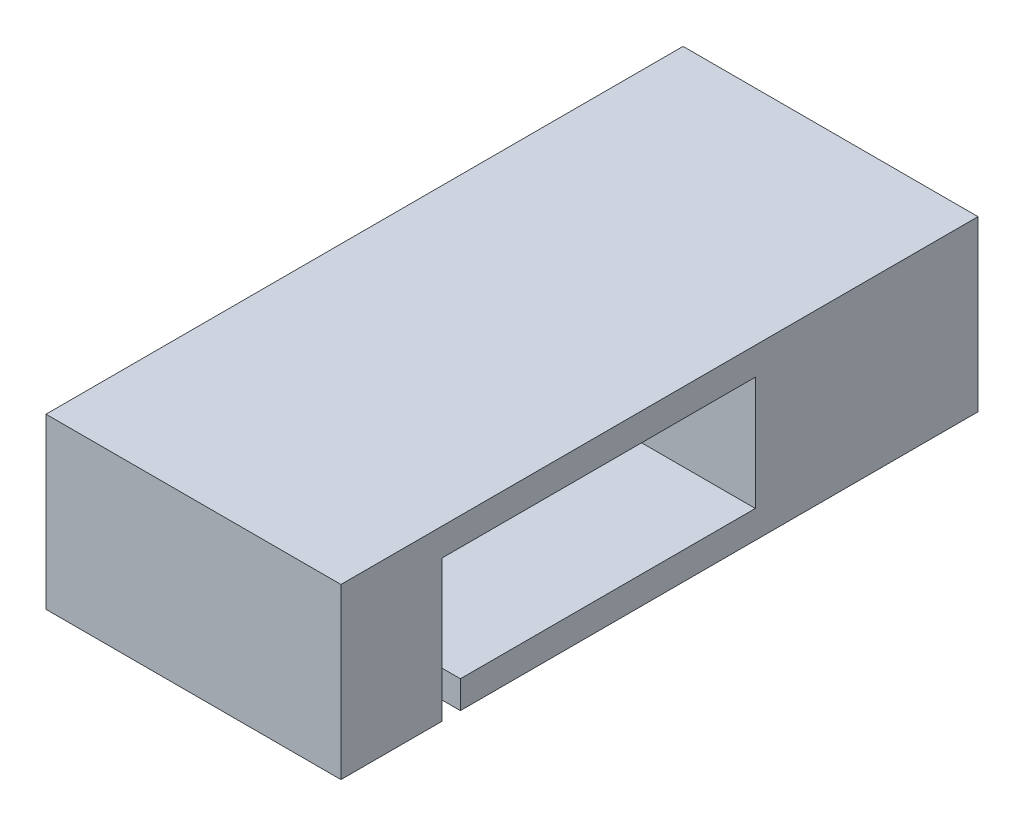
ISO-10303-21;
HEADER;
FILE_DESCRIPTION(('STEP AP214'),'2;1');
FILE_NAME('part.step','',(''),(''),'','','');
FILE_SCHEMA(('AUTOMOTIVE_DESIGN { 1 0 10303 214 1 1 1 1 }'));
ENDSEC;
DATA;
#1=APPLICATION_CONTEXT('core data for automotive mechanical design processes');
#2=APPLICATION_PROTOCOL_DEFINITION('international standard','automotive_design',2000,#1);
#3=PRODUCT_CONTEXT('',#1,'mechanical');
#4=PRODUCT('Part','Part','',(#3));
#5=PRODUCT_RELATED_PRODUCT_CATEGORY('part','',(#4));
#6=PRODUCT_DEFINITION_FORMATION('','',#4);
#7=PRODUCT_DEFINITION_CONTEXT('part definition',#1,'design');
#8=PRODUCT_DEFINITION('design','',#6,#7);
#9=PRODUCT_DEFINITION_SHAPE('','',#8);
#10=(LENGTH_UNIT() NAMED_UNIT(*) SI_UNIT(.MILLI.,.METRE.));
#11=(NAMED_UNIT(*) PLANE_ANGLE_UNIT() SI_UNIT($,.RADIAN.));
#12=(NAMED_UNIT(*) SI_UNIT($,.STERADIAN.) SOLID_ANGLE_UNIT());
#13=UNCERTAINTY_MEASURE_WITH_UNIT(LENGTH_MEASURE(1.E-05),#10,'distance_accuracy_value','');
#14=(GEOMETRIC_REPRESENTATION_CONTEXT(3) GLOBAL_UNCERTAINTY_ASSIGNED_CONTEXT((#13)) GLOBAL_UNIT_ASSIGNED_CONTEXT((#10,
#11,#12)) REPRESENTATION_CONTEXT('',''));
#15=CARTESIAN_POINT('',(0.,0.,0.));
#16=DIRECTION('',(0.,0.,1.));
#17=DIRECTION('',(1.,0.,0.));
#18=AXIS2_PLACEMENT_3D('',#15,#16,#17);
#19=CARTESIAN_POINT('',(16.,18.34,34.56));
#20=DIRECTION('',(-1.,0.,0.));
#21=DIRECTION('',(0.,0.,1.));
#22=AXIS2_PLACEMENT_3D('',#19,#20,#21);
#23=PLANE('',#22);
#24=DIRECTION('',(0.,0.,-1.));
#25=VECTOR('',#24,1.);
#26=CARTESIAN_POINT('',(16.,3.,21.6));
#27=LINE('',#26,#25);
#28=CARTESIAN_POINT('',(16.,3.,21.6));
#29=VERTEX_POINT('',#28);
#30=CARTESIAN_POINT('',(16.,3.,-10.4));
#31=VERTEX_POINT('',#30);
#32=EDGE_CURVE('E136',#29,#31,#27,.T.);
#33=ORIENTED_EDGE('',*,*,#32,.F.);
#34=DIRECTION('',(0.,1.,0.));
#35=VECTOR('',#34,1.);
#36=CARTESIAN_POINT('',(16.,0.,21.6));
#37=LINE('',#36,#35);
#38=CARTESIAN_POINT('',(16.,0.,21.6));
#39=VERTEX_POINT('',#38);
#40=EDGE_CURVE('E153',#39,#29,#37,.T.);
#41=ORIENTED_EDGE('',*,*,#40,.F.);
#42=DIRECTION('',(0.,0.,-1.));
#43=VECTOR('',#42,1.);
#44=CARTESIAN_POINT('',(16.,0.,34.56));
#45=LINE('',#44,#43);
#46=CARTESIAN_POINT('',(16.,0.,-34.56));
#47=VERTEX_POINT('',#46);
#48=EDGE_CURVE('E176',#39,#47,#45,.T.);
#49=ORIENTED_EDGE('',*,*,#48,.T.);
#50=DIRECTION('',(0.,-1.,0.));
#51=VECTOR('',#50,1.);
#52=CARTESIAN_POINT('',(16.,18.34,-34.56));
#53=LINE('',#52,#51);
#54=CARTESIAN_POINT('',(16.,18.34,-34.56));
#55=VERTEX_POINT('',#54);
#56=EDGE_CURVE('E49',#55,#47,#53,.T.);
#57=ORIENTED_EDGE('',*,*,#56,.F.);
#58=DIRECTION('',(0.,0.,-1.));
#59=VECTOR('',#58,1.);
#60=CARTESIAN_POINT('',(16.,18.34,34.56));
#61=LINE('',#60,#59);
#62=CARTESIAN_POINT('',(16.,18.34,34.56));
#63=VERTEX_POINT('',#62);
#64=EDGE_CURVE('E183',#63,#55,#61,.T.);
#65=ORIENTED_EDGE('',*,*,#64,.F.);
#66=DIRECTION('',(0.,-1.,0.));
#67=VECTOR('',#66,1.);
#68=CARTESIAN_POINT('',(16.,18.34,34.56));
#69=LINE('',#68,#67);
#70=CARTESIAN_POINT('',(16.,0.,34.56));
#71=VERTEX_POINT('',#70);
#72=EDGE_CURVE('E189',#63,#71,#69,.T.);
#73=ORIENTED_EDGE('',*,*,#72,.T.);
#74=CARTESIAN_POINT('',(16.,0.,23.6));
#75=VERTEX_POINT('',#74);
#76=EDGE_CURVE('E190',#71,#75,#45,.T.);
#77=ORIENTED_EDGE('',*,*,#76,.T.);
#78=DIRECTION('',(0.,-1.,0.));
#79=VECTOR('',#78,1.);
#80=CARTESIAN_POINT('',(16.,3.,23.6));
#81=LINE('',#80,#79);
#82=CARTESIAN_POINT('',(16.,15.34,23.6));
#83=VERTEX_POINT('',#82);
#84=EDGE_CURVE('E156',#83,#75,#81,.T.);
#85=ORIENTED_EDGE('',*,*,#84,.F.);
#86=DIRECTION('',(0.,0.,1.));
#87=VECTOR('',#86,1.);
#88=CARTESIAN_POINT('',(16.,15.34,23.6));
#89=LINE('',#88,#87);
#90=CARTESIAN_POINT('',(16.,15.34,-10.4));
#91=VERTEX_POINT('',#90);
#92=EDGE_CURVE('E170',#91,#83,#89,.T.);
#93=ORIENTED_EDGE('',*,*,#92,.F.);
#94=DIRECTION('',(0.,1.,0.));
#95=VECTOR('',#94,1.);
#96=CARTESIAN_POINT('',(16.,15.34,-10.4));
#97=LINE('',#96,#95);
#98=EDGE_CURVE('E168',#31,#91,#97,.T.);
#99=ORIENTED_EDGE('',*,*,#98,.F.);
#100=EDGE_LOOP('',(#33,#41,#49,#57,#65,#73,#77,#85,#93,#99));
#101=FACE_BOUND('',#100,.T.);
#102=ADVANCED_FACE('F42',(#101),#23,.F.);
#103=CARTESIAN_POINT('',(-16.,18.34,-34.56));
#104=DIRECTION('',(0.,0.,1.));
#105=DIRECTION('',(1.,0.,0.));
#106=AXIS2_PLACEMENT_3D('',#103,#104,#105);
#107=PLANE('',#106);
#108=DIRECTION('',(-1.,0.,0.));
#109=VECTOR('',#108,1.);
#110=CARTESIAN_POINT('',(-16.,0.,-34.56));
#111=LINE('',#110,#109);
#112=CARTESIAN_POINT('',(-16.,0.,-34.56));
#113=VERTEX_POINT('',#112);
#114=EDGE_CURVE('E193',#47,#113,#111,.T.);
#115=ORIENTED_EDGE('',*,*,#114,.T.);
#116=DIRECTION('',(0.,-1.,0.));
#117=VECTOR('',#116,1.);
#118=CARTESIAN_POINT('',(-16.,18.34,-34.56));
#119=LINE('',#118,#117);
#120=CARTESIAN_POINT('',(-16.,18.34,-34.56));
#121=VERTEX_POINT('',#120);
#122=EDGE_CURVE('E201',#121,#113,#119,.T.);
#123=ORIENTED_EDGE('',*,*,#122,.F.);
#124=DIRECTION('',(-1.,0.,0.));
#125=VECTOR('',#124,1.);
#126=CARTESIAN_POINT('',(-16.,18.34,-34.56));
#127=LINE('',#126,#125);
#128=EDGE_CURVE('E94',#55,#121,#127,.T.);
#129=ORIENTED_EDGE('',*,*,#128,.F.);
#130=ORIENTED_EDGE('',*,*,#56,.T.);
#131=EDGE_LOOP('',(#115,#123,#129,#130));
#132=FACE_BOUND('',#131,.T.);
#133=ADVANCED_FACE('F204',(#132),#107,.F.);
#134=CARTESIAN_POINT('',(-16.,18.34,34.56));
#135=DIRECTION('',(1.,0.,0.));
#136=DIRECTION('',(0.,0.,-1.));
#137=AXIS2_PLACEMENT_3D('',#134,#135,#136);
#138=PLANE('',#137);
#139=CARTESIAN_POINT('',(-16.,9.17,0.));
#140=DIRECTION('',(1.,0.,0.));
#141=DIRECTION('',(0.,0.,-1.));
#142=AXIS2_PLACEMENT_3D('',#139,#140,#141);
#143=CIRCLE('',#142,2.305);
#144=CARTESIAN_POINT('',(-16.,9.17,-2.305));
#145=VERTEX_POINT('',#144);
#146=EDGE_CURVE('E11',#145,#145,#143,.F.);
#147=ORIENTED_EDGE('',*,*,#146,.F.);
#148=EDGE_LOOP('',(#147));
#149=FACE_BOUND('',#148,.T.);
#150=DIRECTION('',(0.,0.,1.));
#151=VECTOR('',#150,1.);
#152=CARTESIAN_POINT('',(-16.,0.,34.56));
#153=LINE('',#152,#151);
#154=CARTESIAN_POINT('',(-16.,0.,34.56));
#155=VERTEX_POINT('',#154);
#156=EDGE_CURVE('E195',#113,#155,#153,.T.);
#157=ORIENTED_EDGE('',*,*,#156,.T.);
#158=DIRECTION('',(0.,-1.,0.));
#159=VECTOR('',#158,1.);
#160=CARTESIAN_POINT('',(-16.,18.34,34.56));
#161=LINE('',#160,#159);
#162=CARTESIAN_POINT('',(-16.,18.34,34.56));
#163=VERTEX_POINT('',#162);
#164=EDGE_CURVE('E199',#163,#155,#161,.T.);
#165=ORIENTED_EDGE('',*,*,#164,.F.);
#166=DIRECTION('',(0.,0.,1.));
#167=VECTOR('',#166,1.);
#168=CARTESIAN_POINT('',(-16.,18.34,34.56));
#169=LINE('',#168,#167);
#170=EDGE_CURVE('E186',#121,#163,#169,.T.);
#171=ORIENTED_EDGE('',*,*,#170,.F.);
#172=ORIENTED_EDGE('',*,*,#122,.T.);
#173=EDGE_LOOP('',(#157,#165,#171,#172));
#174=FACE_BOUND('',#173,.T.);
#175=ADVANCED_FACE('F217',(#149,#174),#138,.F.);
#176=CARTESIAN_POINT('',(-16.,18.34,34.56));
#177=DIRECTION('',(0.,0.,-1.));
#178=DIRECTION('',(-1.,0.,0.));
#179=AXIS2_PLACEMENT_3D('',#176,#177,#178);
#180=PLANE('',#179);
#181=DIRECTION('',(1.,0.,0.));
#182=VECTOR('',#181,1.);
#183=CARTESIAN_POINT('',(-16.,0.,34.56));
#184=LINE('',#183,#182);
#185=EDGE_CURVE('E86',#155,#71,#184,.T.);
#186=ORIENTED_EDGE('',*,*,#185,.T.);
#187=ORIENTED_EDGE('',*,*,#72,.F.);
#188=DIRECTION('',(1.,0.,0.));
#189=VECTOR('',#188,1.);
#190=CARTESIAN_POINT('',(-16.,18.34,34.56));
#191=LINE('',#190,#189);
#192=EDGE_CURVE('E65',#163,#63,#191,.T.);
#193=ORIENTED_EDGE('',*,*,#192,.F.);
#194=ORIENTED_EDGE('',*,*,#164,.T.);
#195=EDGE_LOOP('',(#186,#187,#193,#194));
#196=FACE_BOUND('',#195,.T.);
#197=ADVANCED_FACE('F219',(#196),#180,.F.);
#198=CARTESIAN_POINT('',(0.,18.34,0.));
#199=DIRECTION('',(0.,-1.,0.));
#200=DIRECTION('',(0.,0.,-1.));
#201=AXIS2_PLACEMENT_3D('',#198,#199,#200);
#202=PLANE('',#201);
#203=ORIENTED_EDGE('',*,*,#64,.T.);
#204=ORIENTED_EDGE('',*,*,#128,.T.);
#205=ORIENTED_EDGE('',*,*,#170,.T.);
#206=ORIENTED_EDGE('',*,*,#192,.T.);
#207=EDGE_LOOP('',(#203,#204,#205,#206));
#208=FACE_BOUND('',#207,.T.);
#209=ADVANCED_FACE('F248',(#208),#202,.F.);
#210=CARTESIAN_POINT('',(0.,0.,0.));
#211=DIRECTION('',(0.,-1.,0.));
#212=DIRECTION('',(0.,0.,-1.));
#213=AXIS2_PLACEMENT_3D('',#210,#211,#212);
#214=PLANE('',#213);
#215=DIRECTION('',(1.,0.,0.));
#216=VECTOR('',#215,1.);
#217=CARTESIAN_POINT('',(-13.,0.,21.6));
#218=LINE('',#217,#216);
#219=CARTESIAN_POINT('',(-13.,0.,21.6));
#220=VERTEX_POINT('',#219);
#221=EDGE_CURVE('E177',#220,#39,#218,.T.);
#222=ORIENTED_EDGE('',*,*,#221,.F.);
#223=DIRECTION('',(0.,0.,-1.));
#224=VECTOR('',#223,1.);
#225=CARTESIAN_POINT('',(-13.,0.,23.6));
#226=LINE('',#225,#224);
#227=CARTESIAN_POINT('',(-13.,0.,23.6));
#228=VERTEX_POINT('',#227);
#229=EDGE_CURVE('E164',#228,#220,#226,.T.);
#230=ORIENTED_EDGE('',*,*,#229,.F.);
#231=DIRECTION('',(1.,0.,0.));
#232=VECTOR('',#231,1.);
#233=CARTESIAN_POINT('',(-13.,0.,23.6));
#234=LINE('',#233,#232);
#235=EDGE_CURVE('E56',#228,#75,#234,.T.);
#236=ORIENTED_EDGE('',*,*,#235,.T.);
#237=ORIENTED_EDGE('',*,*,#76,.F.);
#238=ORIENTED_EDGE('',*,*,#185,.F.);
#239=ORIENTED_EDGE('',*,*,#156,.F.);
#240=ORIENTED_EDGE('',*,*,#114,.F.);
#241=ORIENTED_EDGE('',*,*,#48,.F.);
#242=EDGE_LOOP('',(#222,#230,#236,#237,#238,#239,#240,#241));
#243=FACE_BOUND('',#242,.T.);
#244=ADVANCED_FACE('F213',(#243),#214,.T.);
#245=CARTESIAN_POINT('',(-13.,3.,21.6));
#246=DIRECTION('',(0.,-1.,0.));
#247=DIRECTION('',(0.,0.,-1.));
#248=AXIS2_PLACEMENT_3D('',#245,#246,#247);
#249=PLANE('',#248);
#250=ORIENTED_EDGE('',*,*,#32,.T.);
#251=DIRECTION('',(1.,0.,0.));
#252=VECTOR('',#251,1.);
#253=CARTESIAN_POINT('',(-13.,3.,-10.4));
#254=LINE('',#253,#252);
#255=CARTESIAN_POINT('',(-13.,3.,-10.4));
#256=VERTEX_POINT('',#255);
#257=EDGE_CURVE('E129',#256,#31,#254,.T.);
#258=ORIENTED_EDGE('',*,*,#257,.F.);
#259=DIRECTION('',(0.,0.,-1.));
#260=VECTOR('',#259,1.);
#261=CARTESIAN_POINT('',(-13.,3.,21.6));
#262=LINE('',#261,#260);
#263=CARTESIAN_POINT('',(-13.,3.,21.6));
#264=VERTEX_POINT('',#263);
#265=EDGE_CURVE('E133',#264,#256,#262,.T.);
#266=ORIENTED_EDGE('',*,*,#265,.F.);
#267=DIRECTION('',(1.,0.,0.));
#268=VECTOR('',#267,1.);
#269=CARTESIAN_POINT('',(-13.,3.,21.6));
#270=LINE('',#269,#268);
#271=EDGE_CURVE('E174',#264,#29,#270,.T.);
#272=ORIENTED_EDGE('',*,*,#271,.T.);
#273=EDGE_LOOP('',(#250,#258,#266,#272));
#274=FACE_BOUND('',#273,.T.);
#275=ADVANCED_FACE('F131',(#274),#249,.F.);
#276=CARTESIAN_POINT('',(-13.,0.,21.6));
#277=DIRECTION('',(0.,0.,-1.));
#278=DIRECTION('',(-1.,0.,0.));
#279=AXIS2_PLACEMENT_3D('',#276,#277,#278);
#280=PLANE('',#279);
#281=ORIENTED_EDGE('',*,*,#40,.T.);
#282=ORIENTED_EDGE('',*,*,#271,.F.);
#283=DIRECTION('',(0.,1.,0.));
#284=VECTOR('',#283,1.);
#285=CARTESIAN_POINT('',(-13.,0.,21.6));
#286=LINE('',#285,#284);
#287=EDGE_CURVE('E141',#220,#264,#286,.T.);
#288=ORIENTED_EDGE('',*,*,#287,.F.);
#289=ORIENTED_EDGE('',*,*,#221,.T.);
#290=EDGE_LOOP('',(#281,#282,#288,#289));
#291=FACE_BOUND('',#290,.T.);
#292=ADVANCED_FACE('F223',(#291),#280,.F.);
#293=CARTESIAN_POINT('',(-13.,3.,23.6));
#294=DIRECTION('',(0.,0.,1.));
#295=DIRECTION('',(1.,0.,0.));
#296=AXIS2_PLACEMENT_3D('',#293,#294,#295);
#297=PLANE('',#296);
#298=ORIENTED_EDGE('',*,*,#84,.T.);
#299=ORIENTED_EDGE('',*,*,#235,.F.);
#300=DIRECTION('',(0.,-1.,0.));
#301=VECTOR('',#300,1.);
#302=CARTESIAN_POINT('',(-13.,15.34,23.6));
#303=LINE('',#302,#301);
#304=CARTESIAN_POINT('',(-13.,15.34,23.6));
#305=VERTEX_POINT('',#304);
#306=EDGE_CURVE('E162',#305,#228,#303,.T.);
#307=ORIENTED_EDGE('',*,*,#306,.F.);
#308=DIRECTION('',(1.,0.,0.));
#309=VECTOR('',#308,1.);
#310=CARTESIAN_POINT('',(-13.,15.34,23.6));
#311=LINE('',#310,#309);
#312=EDGE_CURVE('E180',#305,#83,#311,.T.);
#313=ORIENTED_EDGE('',*,*,#312,.T.);
#314=EDGE_LOOP('',(#298,#299,#307,#313));
#315=FACE_BOUND('',#314,.T.);
#316=ADVANCED_FACE('F227',(#315),#297,.F.);
#317=CARTESIAN_POINT('',(-13.,15.34,23.6));
#318=DIRECTION('',(0.,1.,0.));
#319=DIRECTION('',(0.,0.,1.));
#320=AXIS2_PLACEMENT_3D('',#317,#318,#319);
#321=PLANE('',#320);
#322=ORIENTED_EDGE('',*,*,#92,.T.);
#323=ORIENTED_EDGE('',*,*,#312,.F.);
#324=DIRECTION('',(0.,0.,1.));
#325=VECTOR('',#324,1.);
#326=CARTESIAN_POINT('',(-13.,15.34,23.6));
#327=LINE('',#326,#325);
#328=CARTESIAN_POINT('',(-13.,15.34,-10.4));
#329=VERTEX_POINT('',#328);
#330=EDGE_CURVE('E149',#329,#305,#327,.T.);
#331=ORIENTED_EDGE('',*,*,#330,.F.);
#332=DIRECTION('',(1.,0.,0.));
#333=VECTOR('',#332,1.);
#334=CARTESIAN_POINT('',(-13.,15.34,-10.4));
#335=LINE('',#334,#333);
#336=EDGE_CURVE('E140',#329,#91,#335,.T.);
#337=ORIENTED_EDGE('',*,*,#336,.T.);
#338=EDGE_LOOP('',(#322,#323,#331,#337));
#339=FACE_BOUND('',#338,.T.);
#340=ADVANCED_FACE('F226',(#339),#321,.F.);
#341=CARTESIAN_POINT('',(-13.,15.34,-10.4));
#342=DIRECTION('',(0.,0.,-1.));
#343=DIRECTION('',(0.,1.,0.));
#344=AXIS2_PLACEMENT_3D('',#341,#342,#343);
#345=PLANE('',#344);
#346=ORIENTED_EDGE('',*,*,#98,.T.);
#347=ORIENTED_EDGE('',*,*,#336,.F.);
#348=DIRECTION('',(0.,1.,0.));
#349=VECTOR('',#348,1.);
#350=CARTESIAN_POINT('',(-13.,15.34,-10.4));
#351=LINE('',#350,#349);
#352=EDGE_CURVE('E144',#256,#329,#351,.T.);
#353=ORIENTED_EDGE('',*,*,#352,.F.);
#354=ORIENTED_EDGE('',*,*,#257,.T.);
#355=EDGE_LOOP('',(#346,#347,#353,#354));
#356=FACE_BOUND('',#355,.T.);
#357=ADVANCED_FACE('F145',(#356),#345,.F.);
#358=CARTESIAN_POINT('',(-13.,0.,0.));
#359=DIRECTION('',(-1.,0.,0.));
#360=DIRECTION('',(0.,0.,1.));
#361=AXIS2_PLACEMENT_3D('',#358,#359,#360);
#362=PLANE('',#361);
#363=ORIENTED_EDGE('',*,*,#265,.T.);
#364=ORIENTED_EDGE('',*,*,#352,.T.);
#365=ORIENTED_EDGE('',*,*,#330,.T.);
#366=ORIENTED_EDGE('',*,*,#306,.T.);
#367=ORIENTED_EDGE('',*,*,#229,.T.);
#368=ORIENTED_EDGE('',*,*,#287,.T.);
#369=EDGE_LOOP('',(#363,#364,#365,#366,#367,#368));
#370=FACE_BOUND('',#369,.T.);
#371=ADVANCED_FACE('F151',(#370),#362,.F.);
#372=CARTESIAN_POINT('',(-22.,9.17,0.));
#373=DIRECTION('',(1.,0.,0.));
#374=DIRECTION('',(0.,0.,-1.));
#375=AXIS2_PLACEMENT_3D('',#372,#373,#374);
#376=CYLINDRICAL_SURFACE('',#375,2.305);
#377=CARTESIAN_POINT('',(-22.,9.17,0.));
#378=DIRECTION('',(-1.,0.,0.));
#379=DIRECTION('',(0.,0.,1.));
#380=AXIS2_PLACEMENT_3D('',#377,#378,#379);
#381=CIRCLE('',#380,2.305);
#382=CARTESIAN_POINT('',(-22.,9.17,2.305));
#383=VERTEX_POINT('',#382);
#384=EDGE_CURVE('E159',#383,#383,#381,.T.);
#385=ORIENTED_EDGE('',*,*,#384,.F.);
#386=EDGE_LOOP('',(#385));
#387=FACE_BOUND('',#386,.T.);
#388=ORIENTED_EDGE('',*,*,#146,.T.);
#389=EDGE_LOOP('',(#388));
#390=FACE_BOUND('',#389,.T.);
#391=ADVANCED_FACE('F259',(#387,#390),#376,.T.);
#392=CARTESIAN_POINT('',(-22.,9.17,0.));
#393=DIRECTION('',(-1.,0.,0.));
#394=DIRECTION('',(0.,0.,1.));
#395=AXIS2_PLACEMENT_3D('',#392,#393,#394);
#396=PLANE('',#395);
#397=ORIENTED_EDGE('',*,*,#384,.T.);
#398=EDGE_LOOP('',(#397));
#399=FACE_BOUND('',#398,.T.);
#400=ADVANCED_FACE('F264',(#399),#396,.T.);
#401=CLOSED_SHELL('',(#102,#133,#175,#197,#209,#244,#275,#292,#316,#340,#357,#371,#391,#400));
#402=MANIFOLD_SOLID_BREP('B2',#401);
#403=ADVANCED_BREP_SHAPE_REPRESENTATION('',(#18,#402),#14);
#404=SHAPE_DEFINITION_REPRESENTATION(#9,#403);
ENDSEC;
END-ISO-10303-21;
